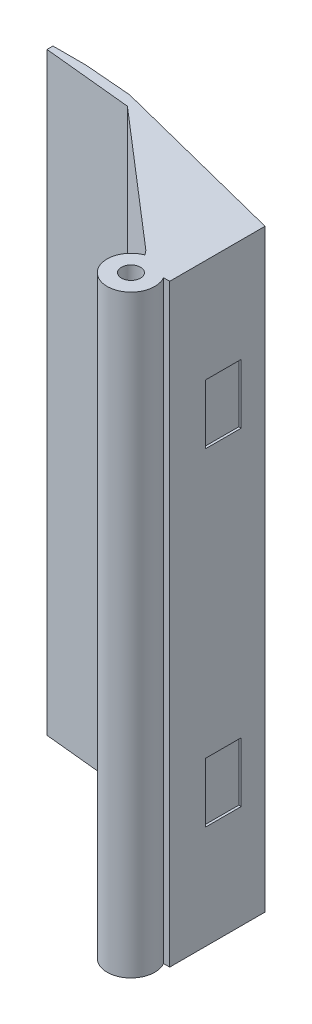
ISO-10303-21;
HEADER;
FILE_DESCRIPTION(('STEP AP214'),'2;1');
FILE_NAME('part.step','',(''),(''),'','','');
FILE_SCHEMA(('AUTOMOTIVE_DESIGN { 1 0 10303 214 1 1 1 1 }'));
ENDSEC;
DATA;
#1=APPLICATION_CONTEXT('core data for automotive mechanical design processes');
#2=APPLICATION_PROTOCOL_DEFINITION('international standard','automotive_design',2000,#1);
#3=PRODUCT_CONTEXT('',#1,'mechanical');
#4=PRODUCT('Part','Part','',(#3));
#5=PRODUCT_RELATED_PRODUCT_CATEGORY('part','',(#4));
#6=PRODUCT_DEFINITION_FORMATION('','',#4);
#7=PRODUCT_DEFINITION_CONTEXT('part definition',#1,'design');
#8=PRODUCT_DEFINITION('design','',#6,#7);
#9=PRODUCT_DEFINITION_SHAPE('','',#8);
#10=(LENGTH_UNIT() NAMED_UNIT(*) SI_UNIT(.MILLI.,.METRE.));
#11=(NAMED_UNIT(*) PLANE_ANGLE_UNIT() SI_UNIT($,.RADIAN.));
#12=(NAMED_UNIT(*) SI_UNIT($,.STERADIAN.) SOLID_ANGLE_UNIT());
#13=UNCERTAINTY_MEASURE_WITH_UNIT(LENGTH_MEASURE(1.E-05),#10,'distance_accuracy_value','');
#14=(GEOMETRIC_REPRESENTATION_CONTEXT(3) GLOBAL_UNCERTAINTY_ASSIGNED_CONTEXT((#13)) GLOBAL_UNIT_ASSIGNED_CONTEXT((#10,
#11,#12)) REPRESENTATION_CONTEXT('',''));
#15=CARTESIAN_POINT('',(0.,0.,0.));
#16=DIRECTION('',(0.,0.,1.));
#17=DIRECTION('',(1.,0.,0.));
#18=AXIS2_PLACEMENT_3D('',#15,#16,#17);
#19=CARTESIAN_POINT('',(-187.,-99.7,1.2));
#20=DIRECTION('',(0.,0.,-1.));
#21=DIRECTION('',(-1.,0.,0.));
#22=AXIS2_PLACEMENT_3D('',#19,#20,#21);
#23=PLANE('',#22);
#24=DIRECTION('',(0.,1.,0.));
#25=VECTOR('',#24,1.);
#26=CARTESIAN_POINT('',(-198.,-99.7,1.2));
#27=LINE('',#26,#25);
#28=CARTESIAN_POINT('',(-198.,-99.7,1.2));
#29=VERTEX_POINT('',#28);
#30=CARTESIAN_POINT('',(-198.,99.7,1.2));
#31=VERTEX_POINT('',#30);
#32=EDGE_CURVE('E281',#29,#31,#27,.T.);
#33=ORIENTED_EDGE('',*,*,#32,.T.);
#34=DIRECTION('',(-1.,0.,0.));
#35=VECTOR('',#34,1.);
#36=CARTESIAN_POINT('',(-187.,99.7,1.2));
#37=LINE('',#36,#35);
#38=CARTESIAN_POINT('',(-187.,99.7,1.2));
#39=VERTEX_POINT('',#38);
#40=EDGE_CURVE('E229',#39,#31,#37,.T.);
#41=ORIENTED_EDGE('',*,*,#40,.F.);
#42=DIRECTION('',(0.,1.,0.));
#43=VECTOR('',#42,1.);
#44=CARTESIAN_POINT('',(-187.,-99.7,1.2));
#45=LINE('',#44,#43);
#46=CARTESIAN_POINT('',(-187.,-99.7,1.2));
#47=VERTEX_POINT('',#46);
#48=EDGE_CURVE('E282',#47,#39,#45,.T.);
#49=ORIENTED_EDGE('',*,*,#48,.F.);
#50=DIRECTION('',(-1.,0.,0.));
#51=VECTOR('',#50,1.);
#52=CARTESIAN_POINT('',(-187.,-99.7,1.2));
#53=LINE('',#52,#51);
#54=EDGE_CURVE('E255',#47,#29,#53,.T.);
#55=ORIENTED_EDGE('',*,*,#54,.T.);
#56=EDGE_LOOP('',(#33,#41,#49,#55));
#57=FACE_BOUND('',#56,.T.);
#58=ADVANCED_FACE('F41',(#57),#23,.T.);
#59=CARTESIAN_POINT('',(-171.,-99.7,2.5));
#60=DIRECTION('',(0.0809831321077377,0.,-0.996715472095232));
#61=DIRECTION('',(-0.996715472095232,0.,-0.0809831321077377));
#62=AXIS2_PLACEMENT_3D('',#59,#60,#61);
#63=PLANE('',#62);
#64=ORIENTED_EDGE('',*,*,#48,.T.);
#65=DIRECTION('',(-0.996715472095232,0.,-0.0809831321077377));
#66=VECTOR('',#65,1.);
#67=CARTESIAN_POINT('',(-171.,99.7,2.5));
#68=LINE('',#67,#66);
#69=CARTESIAN_POINT('',(-171.,99.7,2.5));
#70=VERTEX_POINT('',#69);
#71=EDGE_CURVE('E252',#70,#39,#68,.T.);
#72=ORIENTED_EDGE('',*,*,#71,.F.);
#73=DIRECTION('',(0.,1.,0.));
#74=VECTOR('',#73,1.);
#75=CARTESIAN_POINT('',(-171.,-99.7,2.5));
#76=LINE('',#75,#74);
#77=CARTESIAN_POINT('',(-171.,-99.7,2.5));
#78=VERTEX_POINT('',#77);
#79=EDGE_CURVE('E285',#78,#70,#76,.T.);
#80=ORIENTED_EDGE('',*,*,#79,.F.);
#81=DIRECTION('',(-0.996715472095232,0.,-0.0809831321077377));
#82=VECTOR('',#81,1.);
#83=CARTESIAN_POINT('',(-171.,-99.7,2.5));
#84=LINE('',#83,#82);
#85=EDGE_CURVE('E278',#78,#47,#84,.T.);
#86=ORIENTED_EDGE('',*,*,#85,.T.);
#87=EDGE_LOOP('',(#64,#72,#80,#86));
#88=FACE_BOUND('',#87,.T.);
#89=ADVANCED_FACE('F327',(#88),#63,.T.);
#90=CARTESIAN_POINT('',(-110.,-99.7,18.));
#91=DIRECTION('',(0.246272303220528,0.,-0.969200677190465));
#92=DIRECTION('',(-0.969200677190465,0.,-0.246272303220528));
#93=AXIS2_PLACEMENT_3D('',#90,#91,#92);
#94=PLANE('',#93);
#95=ORIENTED_EDGE('',*,*,#79,.T.);
#96=DIRECTION('',(-0.969200677190465,0.,-0.246272303220528));
#97=VECTOR('',#96,1.);
#98=CARTESIAN_POINT('',(-110.,99.7,18.));
#99=LINE('',#98,#97);
#100=CARTESIAN_POINT('',(-110.,99.7,18.));
#101=VERTEX_POINT('',#100);
#102=EDGE_CURVE('E249',#101,#70,#99,.T.);
#103=ORIENTED_EDGE('',*,*,#102,.F.);
#104=DIRECTION('',(0.,1.,0.));
#105=VECTOR('',#104,1.);
#106=CARTESIAN_POINT('',(-110.,-99.7,18.));
#107=LINE('',#106,#105);
#108=CARTESIAN_POINT('',(-110.,-99.7,18.));
#109=VERTEX_POINT('',#108);
#110=EDGE_CURVE('E287',#109,#101,#107,.T.);
#111=ORIENTED_EDGE('',*,*,#110,.F.);
#112=DIRECTION('',(-0.969200677190465,0.,-0.246272303220528));
#113=VECTOR('',#112,1.);
#114=CARTESIAN_POINT('',(-110.,-99.7,18.));
#115=LINE('',#114,#113);
#116=EDGE_CURVE('E275',#109,#78,#115,.T.);
#117=ORIENTED_EDGE('',*,*,#116,.T.);
#118=EDGE_LOOP('',(#95,#103,#111,#117));
#119=FACE_BOUND('',#118,.T.);
#120=ADVANCED_FACE('F332',(#119),#94,.T.);
#121=CARTESIAN_POINT('',(-110.,-99.7,50.));
#122=DIRECTION('',(1.,0.,0.));
#123=DIRECTION('',(0.,0.,-1.));
#124=AXIS2_PLACEMENT_3D('',#121,#122,#123);
#125=PLANE('',#124);
#126=DIRECTION('',(0.,0.,-1.));
#127=VECTOR('',#126,1.);
#128=CARTESIAN_POINT('',(-110.,45.,50.));
#129=LINE('',#128,#127);
#130=CARTESIAN_POINT('',(-110.,45.,38.));
#131=VERTEX_POINT('',#130);
#132=CARTESIAN_POINT('',(-110.,45.,26.));
#133=VERTEX_POINT('',#132);
#134=EDGE_CURVE('E11',#131,#133,#129,.T.);
#135=ORIENTED_EDGE('',*,*,#134,.F.);
#136=DIRECTION('',(0.,-1.,0.));
#137=VECTOR('',#136,1.);
#138=CARTESIAN_POINT('',(-110.,-99.7,38.));
#139=LINE('',#138,#137);
#140=CARTESIAN_POINT('',(-110.,65.,38.));
#141=VERTEX_POINT('',#140);
#142=EDGE_CURVE('E181',#141,#131,#139,.T.);
#143=ORIENTED_EDGE('',*,*,#142,.F.);
#144=DIRECTION('',(0.,0.,-1.));
#145=VECTOR('',#144,1.);
#146=CARTESIAN_POINT('',(-110.,65.,50.));
#147=LINE('',#146,#145);
#148=CARTESIAN_POINT('',(-110.,65.,26.));
#149=VERTEX_POINT('',#148);
#150=EDGE_CURVE('E309',#141,#149,#147,.T.);
#151=ORIENTED_EDGE('',*,*,#150,.T.);
#152=DIRECTION('',(0.,1.,0.));
#153=VECTOR('',#152,1.);
#154=CARTESIAN_POINT('',(-110.,-99.7,26.));
#155=LINE('',#154,#153);
#156=EDGE_CURVE('E48',#133,#149,#155,.T.);
#157=ORIENTED_EDGE('',*,*,#156,.F.);
#158=EDGE_LOOP('',(#135,#143,#151,#157));
#159=FACE_BOUND('',#158,.T.);
#160=DIRECTION('',(0.,0.,-1.));
#161=VECTOR('',#160,1.);
#162=CARTESIAN_POINT('',(-110.,-65.,50.));
#163=LINE('',#162,#161);
#164=CARTESIAN_POINT('',(-110.,-65.,38.));
#165=VERTEX_POINT('',#164);
#166=CARTESIAN_POINT('',(-110.,-65.,26.));
#167=VERTEX_POINT('',#166);
#168=EDGE_CURVE('E307',#165,#167,#163,.T.);
#169=ORIENTED_EDGE('',*,*,#168,.F.);
#170=DIRECTION('',(0.,-1.,0.));
#171=VECTOR('',#170,1.);
#172=CARTESIAN_POINT('',(-110.,-99.7,38.));
#173=LINE('',#172,#171);
#174=CARTESIAN_POINT('',(-110.,-45.,38.));
#175=VERTEX_POINT('',#174);
#176=EDGE_CURVE('E303',#175,#165,#173,.T.);
#177=ORIENTED_EDGE('',*,*,#176,.F.);
#178=DIRECTION('',(0.,0.,-1.));
#179=VECTOR('',#178,1.);
#180=CARTESIAN_POINT('',(-110.,-45.,50.));
#181=LINE('',#180,#179);
#182=CARTESIAN_POINT('',(-110.,-45.,26.));
#183=VERTEX_POINT('',#182);
#184=EDGE_CURVE('E284',#175,#183,#181,.T.);
#185=ORIENTED_EDGE('',*,*,#184,.T.);
#186=DIRECTION('',(0.,1.,0.));
#187=VECTOR('',#186,1.);
#188=CARTESIAN_POINT('',(-110.,-99.7,26.));
#189=LINE('',#188,#187);
#190=EDGE_CURVE('E305',#167,#183,#189,.T.);
#191=ORIENTED_EDGE('',*,*,#190,.F.);
#192=EDGE_LOOP('',(#169,#177,#185,#191));
#193=FACE_BOUND('',#192,.T.);
#194=ORIENTED_EDGE('',*,*,#110,.T.);
#195=DIRECTION('',(0.,0.,-1.));
#196=VECTOR('',#195,1.);
#197=CARTESIAN_POINT('',(-110.,99.7,50.));
#198=LINE('',#197,#196);
#199=CARTESIAN_POINT('',(-110.,99.7,50.));
#200=VERTEX_POINT('',#199);
#201=EDGE_CURVE('E246',#200,#101,#198,.T.);
#202=ORIENTED_EDGE('',*,*,#201,.F.);
#203=DIRECTION('',(0.,1.,0.));
#204=VECTOR('',#203,1.);
#205=CARTESIAN_POINT('',(-110.,-99.7,50.));
#206=LINE('',#205,#204);
#207=CARTESIAN_POINT('',(-110.,-99.7,50.));
#208=VERTEX_POINT('',#207);
#209=EDGE_CURVE('E289',#208,#200,#206,.T.);
#210=ORIENTED_EDGE('',*,*,#209,.F.);
#211=DIRECTION('',(0.,0.,-1.));
#212=VECTOR('',#211,1.);
#213=CARTESIAN_POINT('',(-110.,-99.7,50.));
#214=LINE('',#213,#212);
#215=EDGE_CURVE('E272',#208,#109,#214,.T.);
#216=ORIENTED_EDGE('',*,*,#215,.T.);
#217=EDGE_LOOP('',(#194,#202,#210,#216));
#218=FACE_BOUND('',#217,.T.);
#219=ADVANCED_FACE('F316',(#159,#193,#218),#125,.T.);
#220=CARTESIAN_POINT('',(-119.,-99.7,50.));
#221=DIRECTION('',(0.,0.,1.));
#222=DIRECTION('',(1.,0.,0.));
#223=AXIS2_PLACEMENT_3D('',#220,#221,#222);
#224=PLANE('',#223);
#225=DIRECTION('',(0.,1.,0.));
#226=VECTOR('',#225,1.);
#227=CARTESIAN_POINT('',(-112.071796769724,-99.7,50.));
#228=LINE('',#227,#226);
#229=CARTESIAN_POINT('',(-112.071796769724,-99.7,50.));
#230=VERTEX_POINT('',#229);
#231=CARTESIAN_POINT('',(-112.071796769724,99.7,50.));
#232=VERTEX_POINT('',#231);
#233=EDGE_CURVE('E227',#230,#232,#228,.T.);
#234=ORIENTED_EDGE('',*,*,#233,.F.);
#235=DIRECTION('',(1.,0.,0.));
#236=VECTOR('',#235,1.);
#237=CARTESIAN_POINT('',(-119.,-99.7,50.));
#238=LINE('',#237,#236);
#239=EDGE_CURVE('E270',#230,#208,#238,.T.);
#240=ORIENTED_EDGE('',*,*,#239,.T.);
#241=ORIENTED_EDGE('',*,*,#209,.T.);
#242=DIRECTION('',(1.,0.,0.));
#243=VECTOR('',#242,1.);
#244=CARTESIAN_POINT('',(-119.,99.7,50.));
#245=LINE('',#244,#243);
#246=EDGE_CURVE('E244',#232,#200,#245,.T.);
#247=ORIENTED_EDGE('',*,*,#246,.F.);
#248=EDGE_LOOP('',(#234,#240,#241,#247));
#249=FACE_BOUND('',#248,.T.);
#250=ADVANCED_FACE('F370',(#249),#224,.T.);
#251=CARTESIAN_POINT('',(-123.,-99.7,45.));
#252=DIRECTION('',(-0.78086880944303,0.,0.624695047554424));
#253=DIRECTION('',(0.624695047554424,0.,0.78086880944303));
#254=AXIS2_PLACEMENT_3D('',#251,#252,#253);
#255=PLANE('',#254);
#256=DIRECTION('',(0.,1.,0.));
#257=VECTOR('',#256,1.);
#258=CARTESIAN_POINT('',(-121.796302462672,-99.7,46.5046219216603));
#259=LINE('',#258,#257);
#260=CARTESIAN_POINT('',(-121.796302462672,99.7,46.5046219216603));
#261=VERTEX_POINT('',#260);
#262=CARTESIAN_POINT('',(-121.796302462672,-99.7,46.5046219216603));
#263=VERTEX_POINT('',#262);
#264=EDGE_CURVE('E225',#261,#263,#259,.F.);
#265=ORIENTED_EDGE('',*,*,#264,.F.);
#266=DIRECTION('',(0.624695047554424,0.,0.78086880944303));
#267=VECTOR('',#266,1.);
#268=CARTESIAN_POINT('',(-123.,99.7,45.));
#269=LINE('',#268,#267);
#270=CARTESIAN_POINT('',(-123.,99.7,45.));
#271=VERTEX_POINT('',#270);
#272=EDGE_CURVE('E241',#271,#261,#269,.T.);
#273=ORIENTED_EDGE('',*,*,#272,.F.);
#274=DIRECTION('',(0.,1.,0.));
#275=VECTOR('',#274,1.);
#276=CARTESIAN_POINT('',(-123.,-99.7,45.));
#277=LINE('',#276,#275);
#278=CARTESIAN_POINT('',(-123.,-99.7,45.));
#279=VERTEX_POINT('',#278);
#280=EDGE_CURVE('E292',#279,#271,#277,.T.);
#281=ORIENTED_EDGE('',*,*,#280,.F.);
#282=DIRECTION('',(0.624695047554424,0.,0.78086880944303));
#283=VECTOR('',#282,1.);
#284=CARTESIAN_POINT('',(-123.,-99.7,45.));
#285=LINE('',#284,#283);
#286=EDGE_CURVE('E267',#279,#263,#285,.T.);
#287=ORIENTED_EDGE('',*,*,#286,.T.);
#288=EDGE_LOOP('',(#265,#273,#281,#287));
#289=FACE_BOUND('',#288,.T.);
#290=ADVANCED_FACE('F362',(#289),#255,.T.);
#291=CARTESIAN_POINT('',(-168.,-99.7,6.2));
#292=DIRECTION('',(-0.653006205037202,0.,0.757352557388507));
#293=DIRECTION('',(0.757352557388507,0.,0.653006205037202));
#294=AXIS2_PLACEMENT_3D('',#291,#292,#293);
#295=PLANE('',#294);
#296=ORIENTED_EDGE('',*,*,#280,.T.);
#297=DIRECTION('',(0.757352557388507,0.,0.653006205037202));
#298=VECTOR('',#297,1.);
#299=CARTESIAN_POINT('',(-168.,99.7,6.2));
#300=LINE('',#299,#298);
#301=CARTESIAN_POINT('',(-168.,99.7,6.2));
#302=VERTEX_POINT('',#301);
#303=EDGE_CURVE('E238',#302,#271,#300,.T.);
#304=ORIENTED_EDGE('',*,*,#303,.F.);
#305=DIRECTION('',(0.,1.,0.));
#306=VECTOR('',#305,1.);
#307=CARTESIAN_POINT('',(-168.,-99.7,6.2));
#308=LINE('',#307,#306);
#309=CARTESIAN_POINT('',(-168.,-99.7,6.2));
#310=VERTEX_POINT('',#309);
#311=EDGE_CURVE('E294',#310,#302,#308,.T.);
#312=ORIENTED_EDGE('',*,*,#311,.F.);
#313=DIRECTION('',(0.757352557388507,0.,0.653006205037202));
#314=VECTOR('',#313,1.);
#315=CARTESIAN_POINT('',(-168.,-99.7,6.2));
#316=LINE('',#315,#314);
#317=EDGE_CURVE('E264',#310,#279,#316,.T.);
#318=ORIENTED_EDGE('',*,*,#317,.T.);
#319=EDGE_LOOP('',(#296,#304,#312,#318));
#320=FACE_BOUND('',#319,.T.);
#321=ADVANCED_FACE('F359',(#320),#295,.T.);
#322=CARTESIAN_POINT('',(-198.,-99.7,3.2));
#323=DIRECTION('',(-0.0995037190209989,0.,0.995037190209989));
#324=DIRECTION('',(0.995037190209989,0.,0.0995037190209989));
#325=AXIS2_PLACEMENT_3D('',#322,#323,#324);
#326=PLANE('',#325);
#327=ORIENTED_EDGE('',*,*,#311,.T.);
#328=DIRECTION('',(0.995037190209989,0.,0.0995037190209989));
#329=VECTOR('',#328,1.);
#330=CARTESIAN_POINT('',(-198.,99.7,3.2));
#331=LINE('',#330,#329);
#332=CARTESIAN_POINT('',(-198.,99.7,3.2));
#333=VERTEX_POINT('',#332);
#334=EDGE_CURVE('E235',#333,#302,#331,.T.);
#335=ORIENTED_EDGE('',*,*,#334,.F.);
#336=DIRECTION('',(0.,1.,0.));
#337=VECTOR('',#336,1.);
#338=CARTESIAN_POINT('',(-198.,-99.7,3.2));
#339=LINE('',#338,#337);
#340=CARTESIAN_POINT('',(-198.,-99.7,3.2));
#341=VERTEX_POINT('',#340);
#342=EDGE_CURVE('E296',#341,#333,#339,.T.);
#343=ORIENTED_EDGE('',*,*,#342,.F.);
#344=DIRECTION('',(0.995037190209989,0.,0.0995037190209989));
#345=VECTOR('',#344,1.);
#346=CARTESIAN_POINT('',(-198.,-99.7,3.2));
#347=LINE('',#346,#345);
#348=EDGE_CURVE('E261',#341,#310,#347,.T.);
#349=ORIENTED_EDGE('',*,*,#348,.T.);
#350=EDGE_LOOP('',(#327,#335,#343,#349));
#351=FACE_BOUND('',#350,.T.);
#352=ADVANCED_FACE('F355',(#351),#326,.T.);
#353=CARTESIAN_POINT('',(-198.,-99.7,1.2));
#354=DIRECTION('',(-1.,0.,0.));
#355=DIRECTION('',(0.,0.,1.));
#356=AXIS2_PLACEMENT_3D('',#353,#354,#355);
#357=PLANE('',#356);
#358=ORIENTED_EDGE('',*,*,#342,.T.);
#359=DIRECTION('',(0.,0.,1.));
#360=VECTOR('',#359,1.);
#361=CARTESIAN_POINT('',(-198.,99.7,1.2));
#362=LINE('',#361,#360);
#363=EDGE_CURVE('E232',#31,#333,#362,.T.);
#364=ORIENTED_EDGE('',*,*,#363,.F.);
#365=ORIENTED_EDGE('',*,*,#32,.F.);
#366=DIRECTION('',(0.,0.,1.));
#367=VECTOR('',#366,1.);
#368=CARTESIAN_POINT('',(-198.,-99.7,1.2));
#369=LINE('',#368,#367);
#370=EDGE_CURVE('E258',#29,#341,#369,.T.);
#371=ORIENTED_EDGE('',*,*,#370,.T.);
#372=EDGE_LOOP('',(#358,#364,#365,#371));
#373=FACE_BOUND('',#372,.T.);
#374=ADVANCED_FACE('F340',(#373),#357,.T.);
#375=CARTESIAN_POINT('',(0.,-99.7,0.));
#376=DIRECTION('',(0.,1.,0.));
#377=DIRECTION('',(0.,0.,1.));
#378=AXIS2_PLACEMENT_3D('',#375,#376,#377);
#379=PLANE('',#378);
#380=CARTESIAN_POINT('',(-119.,-99.7,54.));
#381=DIRECTION('',(0.,1.,0.));
#382=DIRECTION('',(0.,0.,1.));
#383=AXIS2_PLACEMENT_3D('',#380,#381,#382);
#384=CIRCLE('',#383,3.19999999999999);
#385=CARTESIAN_POINT('',(-119.,-99.7,57.2));
#386=VERTEX_POINT('',#385);
#387=EDGE_CURVE('E217',#386,#386,#384,.F.);
#388=ORIENTED_EDGE('',*,*,#387,.F.);
#389=EDGE_LOOP('',(#388));
#390=FACE_BOUND('',#389,.T.);
#391=ORIENTED_EDGE('',*,*,#239,.F.);
#392=CARTESIAN_POINT('',(-119.,-99.7,54.));
#393=DIRECTION('',(0.,1.,0.));
#394=DIRECTION('',(0.,0.,1.));
#395=AXIS2_PLACEMENT_3D('',#392,#393,#394);
#396=CIRCLE('',#395,8.00000000000001);
#397=EDGE_CURVE('E223',#263,#230,#396,.T.);
#398=ORIENTED_EDGE('',*,*,#397,.F.);
#399=ORIENTED_EDGE('',*,*,#286,.F.);
#400=ORIENTED_EDGE('',*,*,#317,.F.);
#401=ORIENTED_EDGE('',*,*,#348,.F.);
#402=ORIENTED_EDGE('',*,*,#370,.F.);
#403=ORIENTED_EDGE('',*,*,#54,.F.);
#404=ORIENTED_EDGE('',*,*,#85,.F.);
#405=ORIENTED_EDGE('',*,*,#116,.F.);
#406=ORIENTED_EDGE('',*,*,#215,.F.);
#407=EDGE_LOOP('',(#391,#398,#399,#400,#401,#402,#403,#404,#405,#406));
#408=FACE_BOUND('',#407,.T.);
#409=ADVANCED_FACE('F349',(#390,#408),#379,.F.);
#410=CARTESIAN_POINT('',(0.,99.7,0.));
#411=DIRECTION('',(0.,1.,0.));
#412=DIRECTION('',(0.,0.,1.));
#413=AXIS2_PLACEMENT_3D('',#410,#411,#412);
#414=PLANE('',#413);
#415=CARTESIAN_POINT('',(-119.,99.7,54.));
#416=DIRECTION('',(0.,1.,0.));
#417=DIRECTION('',(0.,0.,1.));
#418=AXIS2_PLACEMENT_3D('',#415,#416,#417);
#419=CIRCLE('',#418,3.19999999999999);
#420=CARTESIAN_POINT('',(-119.,99.7,57.2));
#421=VERTEX_POINT('',#420);
#422=EDGE_CURVE('E215',#421,#421,#419,.F.);
#423=ORIENTED_EDGE('',*,*,#422,.T.);
#424=EDGE_LOOP('',(#423));
#425=FACE_BOUND('',#424,.T.);
#426=CARTESIAN_POINT('',(-119.,99.7,54.));
#427=DIRECTION('',(0.,1.,0.));
#428=DIRECTION('',(0.,0.,1.));
#429=AXIS2_PLACEMENT_3D('',#426,#427,#428);
#430=CIRCLE('',#429,8.00000000000001);
#431=EDGE_CURVE('E220',#261,#232,#430,.T.);
#432=ORIENTED_EDGE('',*,*,#431,.T.);
#433=ORIENTED_EDGE('',*,*,#246,.T.);
#434=ORIENTED_EDGE('',*,*,#201,.T.);
#435=ORIENTED_EDGE('',*,*,#102,.T.);
#436=ORIENTED_EDGE('',*,*,#71,.T.);
#437=ORIENTED_EDGE('',*,*,#40,.T.);
#438=ORIENTED_EDGE('',*,*,#363,.T.);
#439=ORIENTED_EDGE('',*,*,#334,.T.);
#440=ORIENTED_EDGE('',*,*,#303,.T.);
#441=ORIENTED_EDGE('',*,*,#272,.T.);
#442=EDGE_LOOP('',(#432,#433,#434,#435,#436,#437,#438,#439,#440,#441));
#443=FACE_BOUND('',#442,.T.);
#444=ADVANCED_FACE('F343',(#425,#443),#414,.T.);
#445=CARTESIAN_POINT('',(-119.,-99.7,54.));
#446=DIRECTION('',(0.,1.,0.));
#447=DIRECTION('',(0.,0.,1.));
#448=AXIS2_PLACEMENT_3D('',#445,#446,#447);
#449=CYLINDRICAL_SURFACE('',#448,8.00000000000001);
#450=ORIENTED_EDGE('',*,*,#397,.T.);
#451=ORIENTED_EDGE('',*,*,#233,.T.);
#452=ORIENTED_EDGE('',*,*,#431,.F.);
#453=ORIENTED_EDGE('',*,*,#264,.T.);
#454=EDGE_LOOP('',(#450,#451,#452,#453));
#455=FACE_BOUND('',#454,.T.);
#456=ADVANCED_FACE('F367',(#455),#449,.T.);
#457=CARTESIAN_POINT('',(-119.,110.,54.));
#458=DIRECTION('',(0.,-1.,0.));
#459=DIRECTION('',(0.,0.,-1.));
#460=AXIS2_PLACEMENT_3D('',#457,#458,#459);
#461=CYLINDRICAL_SURFACE('',#460,3.19999999999999);
#462=ORIENTED_EDGE('',*,*,#422,.F.);
#463=EDGE_LOOP('',(#462));
#464=FACE_BOUND('',#463,.T.);
#465=ORIENTED_EDGE('',*,*,#387,.T.);
#466=EDGE_LOOP('',(#465));
#467=FACE_BOUND('',#466,.T.);
#468=ADVANCED_FACE('F406',(#464,#467),#461,.F.);
#469=CARTESIAN_POINT('',(-110.8,-65.,38.));
#470=DIRECTION('',(-1.,0.,0.));
#471=DIRECTION('',(0.,0.,1.));
#472=AXIS2_PLACEMENT_3D('',#469,#470,#471);
#473=PLANE('',#472);
#474=DIRECTION('',(0.,0.,1.));
#475=VECTOR('',#474,1.);
#476=CARTESIAN_POINT('',(-110.8,-45.,38.));
#477=LINE('',#476,#475);
#478=CARTESIAN_POINT('',(-110.8,-45.,26.));
#479=VERTEX_POINT('',#478);
#480=CARTESIAN_POINT('',(-110.8,-45.,38.));
#481=VERTEX_POINT('',#480);
#482=EDGE_CURVE('E195',#479,#481,#477,.T.);
#483=ORIENTED_EDGE('',*,*,#482,.T.);
#484=DIRECTION('',(0.,1.,0.));
#485=VECTOR('',#484,1.);
#486=CARTESIAN_POINT('',(-110.8,-65.,38.));
#487=LINE('',#486,#485);
#488=CARTESIAN_POINT('',(-110.8,-65.,38.));
#489=VERTEX_POINT('',#488);
#490=EDGE_CURVE('E205',#489,#481,#487,.T.);
#491=ORIENTED_EDGE('',*,*,#490,.F.);
#492=DIRECTION('',(0.,0.,1.));
#493=VECTOR('',#492,1.);
#494=CARTESIAN_POINT('',(-110.8,-65.,38.));
#495=LINE('',#494,#493);
#496=CARTESIAN_POINT('',(-110.8,-65.,26.));
#497=VERTEX_POINT('',#496);
#498=EDGE_CURVE('E197',#497,#489,#495,.T.);
#499=ORIENTED_EDGE('',*,*,#498,.F.);
#500=DIRECTION('',(0.,1.,0.));
#501=VECTOR('',#500,1.);
#502=CARTESIAN_POINT('',(-110.8,-65.,26.));
#503=LINE('',#502,#501);
#504=EDGE_CURVE('E212',#497,#479,#503,.T.);
#505=ORIENTED_EDGE('',*,*,#504,.T.);
#506=EDGE_LOOP('',(#483,#491,#499,#505));
#507=FACE_BOUND('',#506,.T.);
#508=ADVANCED_FACE('F409',(#507),#473,.F.);
#509=CARTESIAN_POINT('',(-110.8,-65.,26.));
#510=DIRECTION('',(0.,0.,-1.));
#511=DIRECTION('',(-1.,0.,0.));
#512=AXIS2_PLACEMENT_3D('',#509,#510,#511);
#513=PLANE('',#512);
#514=ORIENTED_EDGE('',*,*,#190,.T.);
#515=DIRECTION('',(-1.,0.,0.));
#516=VECTOR('',#515,1.);
#517=CARTESIAN_POINT('',(-110.8,-45.,26.));
#518=LINE('',#517,#516);
#519=EDGE_CURVE('E63',#183,#479,#518,.T.);
#520=ORIENTED_EDGE('',*,*,#519,.T.);
#521=ORIENTED_EDGE('',*,*,#504,.F.);
#522=DIRECTION('',(-1.,0.,0.));
#523=VECTOR('',#522,1.);
#524=CARTESIAN_POINT('',(-110.8,-65.,26.));
#525=LINE('',#524,#523);
#526=EDGE_CURVE('E203',#167,#497,#525,.T.);
#527=ORIENTED_EDGE('',*,*,#526,.F.);
#528=EDGE_LOOP('',(#514,#520,#521,#527));
#529=FACE_BOUND('',#528,.T.);
#530=ADVANCED_FACE('F413',(#529),#513,.F.);
#531=CARTESIAN_POINT('',(-110.8,-65.,38.));
#532=DIRECTION('',(0.,0.,1.));
#533=DIRECTION('',(1.,0.,0.));
#534=AXIS2_PLACEMENT_3D('',#531,#532,#533);
#535=PLANE('',#534);
#536=ORIENTED_EDGE('',*,*,#176,.T.);
#537=DIRECTION('',(1.,0.,0.));
#538=VECTOR('',#537,1.);
#539=CARTESIAN_POINT('',(-110.8,-65.,38.));
#540=LINE('',#539,#538);
#541=EDGE_CURVE('E200',#489,#165,#540,.T.);
#542=ORIENTED_EDGE('',*,*,#541,.F.);
#543=ORIENTED_EDGE('',*,*,#490,.T.);
#544=DIRECTION('',(1.,0.,0.));
#545=VECTOR('',#544,1.);
#546=CARTESIAN_POINT('',(-110.8,-45.,38.));
#547=LINE('',#546,#545);
#548=EDGE_CURVE('E208',#481,#175,#547,.T.);
#549=ORIENTED_EDGE('',*,*,#548,.T.);
#550=EDGE_LOOP('',(#536,#542,#543,#549));
#551=FACE_BOUND('',#550,.T.);
#552=ADVANCED_FACE('F415',(#551),#535,.F.);
#553=CARTESIAN_POINT('',(0.,-65.,0.));
#554=DIRECTION('',(0.,-1.,0.));
#555=DIRECTION('',(0.,0.,-1.));
#556=AXIS2_PLACEMENT_3D('',#553,#554,#555);
#557=PLANE('',#556);
#558=ORIENTED_EDGE('',*,*,#168,.T.);
#559=ORIENTED_EDGE('',*,*,#526,.T.);
#560=ORIENTED_EDGE('',*,*,#498,.T.);
#561=ORIENTED_EDGE('',*,*,#541,.T.);
#562=EDGE_LOOP('',(#558,#559,#560,#561));
#563=FACE_BOUND('',#562,.T.);
#564=ADVANCED_FACE('F418',(#563),#557,.F.);
#565=CARTESIAN_POINT('',(0.,-45.,0.));
#566=DIRECTION('',(0.,-1.,0.));
#567=DIRECTION('',(0.,0.,-1.));
#568=AXIS2_PLACEMENT_3D('',#565,#566,#567);
#569=PLANE('',#568);
#570=ORIENTED_EDGE('',*,*,#548,.F.);
#571=ORIENTED_EDGE('',*,*,#482,.F.);
#572=ORIENTED_EDGE('',*,*,#519,.F.);
#573=ORIENTED_EDGE('',*,*,#184,.F.);
#574=EDGE_LOOP('',(#570,#571,#572,#573));
#575=FACE_BOUND('',#574,.T.);
#576=ADVANCED_FACE('F423',(#575),#569,.T.);
#577=CARTESIAN_POINT('',(-110.8,45.,38.));
#578=DIRECTION('',(-1.,0.,0.));
#579=DIRECTION('',(0.,0.,1.));
#580=AXIS2_PLACEMENT_3D('',#577,#578,#579);
#581=PLANE('',#580);
#582=DIRECTION('',(0.,0.,1.));
#583=VECTOR('',#582,1.);
#584=CARTESIAN_POINT('',(-110.8,65.,38.));
#585=LINE('',#584,#583);
#586=CARTESIAN_POINT('',(-110.8,65.,26.));
#587=VERTEX_POINT('',#586);
#588=CARTESIAN_POINT('',(-110.8,65.,38.));
#589=VERTEX_POINT('',#588);
#590=EDGE_CURVE('E170',#587,#589,#585,.T.);
#591=ORIENTED_EDGE('',*,*,#590,.T.);
#592=DIRECTION('',(0.,1.,0.));
#593=VECTOR('',#592,1.);
#594=CARTESIAN_POINT('',(-110.8,45.,38.));
#595=LINE('',#594,#593);
#596=CARTESIAN_POINT('',(-110.8,45.,38.));
#597=VERTEX_POINT('',#596);
#598=EDGE_CURVE('E164',#597,#589,#595,.T.);
#599=ORIENTED_EDGE('',*,*,#598,.F.);
#600=DIRECTION('',(0.,0.,1.));
#601=VECTOR('',#600,1.);
#602=CARTESIAN_POINT('',(-110.8,45.,38.));
#603=LINE('',#602,#601);
#604=CARTESIAN_POINT('',(-110.8,45.,26.));
#605=VERTEX_POINT('',#604);
#606=EDGE_CURVE('E169',#605,#597,#603,.T.);
#607=ORIENTED_EDGE('',*,*,#606,.F.);
#608=DIRECTION('',(0.,1.,0.));
#609=VECTOR('',#608,1.);
#610=CARTESIAN_POINT('',(-110.8,45.,26.));
#611=LINE('',#610,#609);
#612=EDGE_CURVE('E174',#605,#587,#611,.T.);
#613=ORIENTED_EDGE('',*,*,#612,.T.);
#614=EDGE_LOOP('',(#591,#599,#607,#613));
#615=FACE_BOUND('',#614,.T.);
#616=ADVANCED_FACE('F166',(#615),#581,.F.);
#617=CARTESIAN_POINT('',(-110.8,45.,26.));
#618=DIRECTION('',(0.,0.,-1.));
#619=DIRECTION('',(-1.,0.,0.));
#620=AXIS2_PLACEMENT_3D('',#617,#618,#619);
#621=PLANE('',#620);
#622=ORIENTED_EDGE('',*,*,#156,.T.);
#623=DIRECTION('',(-1.,0.,0.));
#624=VECTOR('',#623,1.);
#625=CARTESIAN_POINT('',(-110.8,65.,26.));
#626=LINE('',#625,#624);
#627=EDGE_CURVE('E55',#149,#587,#626,.T.);
#628=ORIENTED_EDGE('',*,*,#627,.T.);
#629=ORIENTED_EDGE('',*,*,#612,.F.);
#630=DIRECTION('',(-1.,0.,0.));
#631=VECTOR('',#630,1.);
#632=CARTESIAN_POINT('',(-110.8,45.,26.));
#633=LINE('',#632,#631);
#634=EDGE_CURVE('E175',#133,#605,#633,.T.);
#635=ORIENTED_EDGE('',*,*,#634,.F.);
#636=EDGE_LOOP('',(#622,#628,#629,#635));
#637=FACE_BOUND('',#636,.T.);
#638=ADVANCED_FACE('F314',(#637),#621,.F.);
#639=CARTESIAN_POINT('',(-110.8,45.,38.));
#640=DIRECTION('',(0.,0.,1.));
#641=DIRECTION('',(1.,0.,0.));
#642=AXIS2_PLACEMENT_3D('',#639,#640,#641);
#643=PLANE('',#642);
#644=ORIENTED_EDGE('',*,*,#142,.T.);
#645=DIRECTION('',(1.,0.,0.));
#646=VECTOR('',#645,1.);
#647=CARTESIAN_POINT('',(-110.8,45.,38.));
#648=LINE('',#647,#646);
#649=EDGE_CURVE('E178',#597,#131,#648,.T.);
#650=ORIENTED_EDGE('',*,*,#649,.F.);
#651=ORIENTED_EDGE('',*,*,#598,.T.);
#652=DIRECTION('',(1.,0.,0.));
#653=VECTOR('',#652,1.);
#654=CARTESIAN_POINT('',(-110.8,65.,38.));
#655=LINE('',#654,#653);
#656=EDGE_CURVE('E189',#589,#141,#655,.T.);
#657=ORIENTED_EDGE('',*,*,#656,.T.);
#658=EDGE_LOOP('',(#644,#650,#651,#657));
#659=FACE_BOUND('',#658,.T.);
#660=ADVANCED_FACE('F179',(#659),#643,.F.);
#661=CARTESIAN_POINT('',(0.,45.,0.));
#662=DIRECTION('',(0.,-1.,0.));
#663=DIRECTION('',(0.,0.,-1.));
#664=AXIS2_PLACEMENT_3D('',#661,#662,#663);
#665=PLANE('',#664);
#666=ORIENTED_EDGE('',*,*,#134,.T.);
#667=ORIENTED_EDGE('',*,*,#634,.T.);
#668=ORIENTED_EDGE('',*,*,#606,.T.);
#669=ORIENTED_EDGE('',*,*,#649,.T.);
#670=EDGE_LOOP('',(#666,#667,#668,#669));
#671=FACE_BOUND('',#670,.T.);
#672=ADVANCED_FACE('F185',(#671),#665,.F.);
#673=CARTESIAN_POINT('',(0.,65.,0.));
#674=DIRECTION('',(0.,-1.,0.));
#675=DIRECTION('',(0.,0.,-1.));
#676=AXIS2_PLACEMENT_3D('',#673,#674,#675);
#677=PLANE('',#676);
#678=ORIENTED_EDGE('',*,*,#656,.F.);
#679=ORIENTED_EDGE('',*,*,#590,.F.);
#680=ORIENTED_EDGE('',*,*,#627,.F.);
#681=ORIENTED_EDGE('',*,*,#150,.F.);
#682=EDGE_LOOP('',(#678,#679,#680,#681));
#683=FACE_BOUND('',#682,.T.);
#684=ADVANCED_FACE('F318',(#683),#677,.T.);
#685=CLOSED_SHELL('',(#58,#89,#120,#219,#250,#290,#321,#352,#374,#409,#444,#456,#468,#508,#530,
#552,#564,#576,#616,#638,#660,#672,#684));
#686=MANIFOLD_SOLID_BREP('B2',#685);
#687=ADVANCED_BREP_SHAPE_REPRESENTATION('',(#18,#686),#14);
#688=SHAPE_DEFINITION_REPRESENTATION(#9,#687);
ENDSEC;
END-ISO-10303-21;
